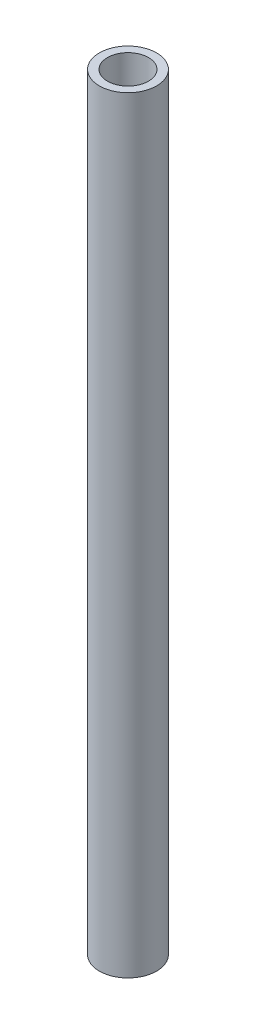
ISO-10303-21;
HEADER;
FILE_DESCRIPTION(('STEP AP214'),'2;1');
FILE_NAME('part.step','',(''),(''),'','','');
FILE_SCHEMA(('AUTOMOTIVE_DESIGN { 1 0 10303 214 1 1 1 1 }'));
ENDSEC;
DATA;
#1=APPLICATION_CONTEXT('core data for automotive mechanical design processes');
#2=APPLICATION_PROTOCOL_DEFINITION('international standard','automotive_design',2000,#1);
#3=PRODUCT_CONTEXT('',#1,'mechanical');
#4=PRODUCT('Part','Part','',(#3));
#5=PRODUCT_RELATED_PRODUCT_CATEGORY('part','',(#4));
#6=PRODUCT_DEFINITION_FORMATION('','',#4);
#7=PRODUCT_DEFINITION_CONTEXT('part definition',#1,'design');
#8=PRODUCT_DEFINITION('design','',#6,#7);
#9=PRODUCT_DEFINITION_SHAPE('','',#8);
#10=(LENGTH_UNIT() NAMED_UNIT(*) SI_UNIT(.MILLI.,.METRE.));
#11=(NAMED_UNIT(*) PLANE_ANGLE_UNIT() SI_UNIT($,.RADIAN.));
#12=(NAMED_UNIT(*) SI_UNIT($,.STERADIAN.) SOLID_ANGLE_UNIT());
#13=UNCERTAINTY_MEASURE_WITH_UNIT(LENGTH_MEASURE(1.E-05),#10,'distance_accuracy_value','');
#14=(GEOMETRIC_REPRESENTATION_CONTEXT(3) GLOBAL_UNCERTAINTY_ASSIGNED_CONTEXT((#13)) GLOBAL_UNIT_ASSIGNED_CONTEXT((#10,
#11,#12)) REPRESENTATION_CONTEXT('',''));
#15=CARTESIAN_POINT('',(0.,0.,0.));
#16=DIRECTION('',(0.,0.,1.));
#17=DIRECTION('',(1.,0.,0.));
#18=AXIS2_PLACEMENT_3D('',#15,#16,#17);
#19=CARTESIAN_POINT('',(0.,285.75,0.));
#20=DIRECTION('',(0.,1.,0.));
#21=DIRECTION('',(0.,0.,1.));
#22=AXIS2_PLACEMENT_3D('',#19,#20,#21);
#23=PLANE('',#22);
#24=CARTESIAN_POINT('',(0.,285.75,0.));
#25=DIRECTION('',(0.,1.,0.));
#26=DIRECTION('',(0.,0.,1.));
#27=AXIS2_PLACEMENT_3D('',#24,#25,#26);
#28=CIRCLE('',#27,10.668);
#29=CARTESIAN_POINT('',(0.,285.75,10.668));
#30=VERTEX_POINT('',#29);
#31=EDGE_CURVE('E10',#30,#30,#28,.T.);
#32=ORIENTED_EDGE('',*,*,#31,.T.);
#33=EDGE_LOOP('',(#32));
#34=FACE_BOUND('',#33,.T.);
#35=CARTESIAN_POINT('',(0.,285.75,0.));
#36=DIRECTION('',(0.,1.,0.));
#37=DIRECTION('',(0.,0.,1.));
#38=AXIS2_PLACEMENT_3D('',#35,#36,#37);
#39=CIRCLE('',#38,7.6454);
#40=CARTESIAN_POINT('',(0.,285.75,7.6454));
#41=VERTEX_POINT('',#40);
#42=EDGE_CURVE('E42',#41,#41,#39,.T.);
#43=ORIENTED_EDGE('',*,*,#42,.F.);
#44=EDGE_LOOP('',(#43));
#45=FACE_BOUND('',#44,.T.);
#46=ADVANCED_FACE('F31',(#34,#45),#23,.T.);
#47=CARTESIAN_POINT('',(0.,0.,0.));
#48=DIRECTION('',(0.,1.,0.));
#49=DIRECTION('',(0.,0.,1.));
#50=AXIS2_PLACEMENT_3D('',#47,#48,#49);
#51=PLANE('',#50);
#52=CARTESIAN_POINT('',(0.,0.,0.));
#53=DIRECTION('',(0.,1.,0.));
#54=DIRECTION('',(0.,0.,1.));
#55=AXIS2_PLACEMENT_3D('',#52,#53,#54);
#56=CIRCLE('',#55,10.668);
#57=CARTESIAN_POINT('',(0.,0.,10.668));
#58=VERTEX_POINT('',#57);
#59=EDGE_CURVE('E35',#58,#58,#56,.T.);
#60=ORIENTED_EDGE('',*,*,#59,.F.);
#61=EDGE_LOOP('',(#60));
#62=FACE_BOUND('',#61,.T.);
#63=CARTESIAN_POINT('',(0.,0.,0.));
#64=DIRECTION('',(0.,1.,0.));
#65=DIRECTION('',(0.,0.,1.));
#66=AXIS2_PLACEMENT_3D('',#63,#64,#65);
#67=CIRCLE('',#66,7.6454);
#68=CARTESIAN_POINT('',(0.,0.,7.6454));
#69=VERTEX_POINT('',#68);
#70=EDGE_CURVE('E44',#69,#69,#67,.T.);
#71=ORIENTED_EDGE('',*,*,#70,.T.);
#72=EDGE_LOOP('',(#71));
#73=FACE_BOUND('',#72,.T.);
#74=ADVANCED_FACE('F54',(#62,#73),#51,.F.);
#75=CARTESIAN_POINT('',(0.,285.75,0.));
#76=DIRECTION('',(0.,-1.,0.));
#77=DIRECTION('',(0.,0.,-1.));
#78=AXIS2_PLACEMENT_3D('',#75,#76,#77);
#79=CYLINDRICAL_SURFACE('',#78,10.668);
#80=ORIENTED_EDGE('',*,*,#31,.F.);
#81=EDGE_LOOP('',(#80));
#82=FACE_BOUND('',#81,.T.);
#83=ORIENTED_EDGE('',*,*,#59,.T.);
#84=EDGE_LOOP('',(#83));
#85=FACE_BOUND('',#84,.T.);
#86=ADVANCED_FACE('F33',(#82,#85),#79,.T.);
#87=CARTESIAN_POINT('',(0.,285.75,0.));
#88=DIRECTION('',(0.,-1.,0.));
#89=DIRECTION('',(0.,0.,-1.));
#90=AXIS2_PLACEMENT_3D('',#87,#88,#89);
#91=CYLINDRICAL_SURFACE('',#90,7.6454);
#92=ORIENTED_EDGE('',*,*,#42,.T.);
#93=EDGE_LOOP('',(#92));
#94=FACE_BOUND('',#93,.T.);
#95=ORIENTED_EDGE('',*,*,#70,.F.);
#96=EDGE_LOOP('',(#95));
#97=FACE_BOUND('',#96,.T.);
#98=ADVANCED_FACE('F50',(#94,#97),#91,.F.);
#99=CLOSED_SHELL('',(#46,#74,#86,#98));
#100=MANIFOLD_SOLID_BREP('B2',#99);
#101=ADVANCED_BREP_SHAPE_REPRESENTATION('',(#18,#100),#14);
#102=SHAPE_DEFINITION_REPRESENTATION(#9,#101);
ENDSEC;
END-ISO-10303-21;
